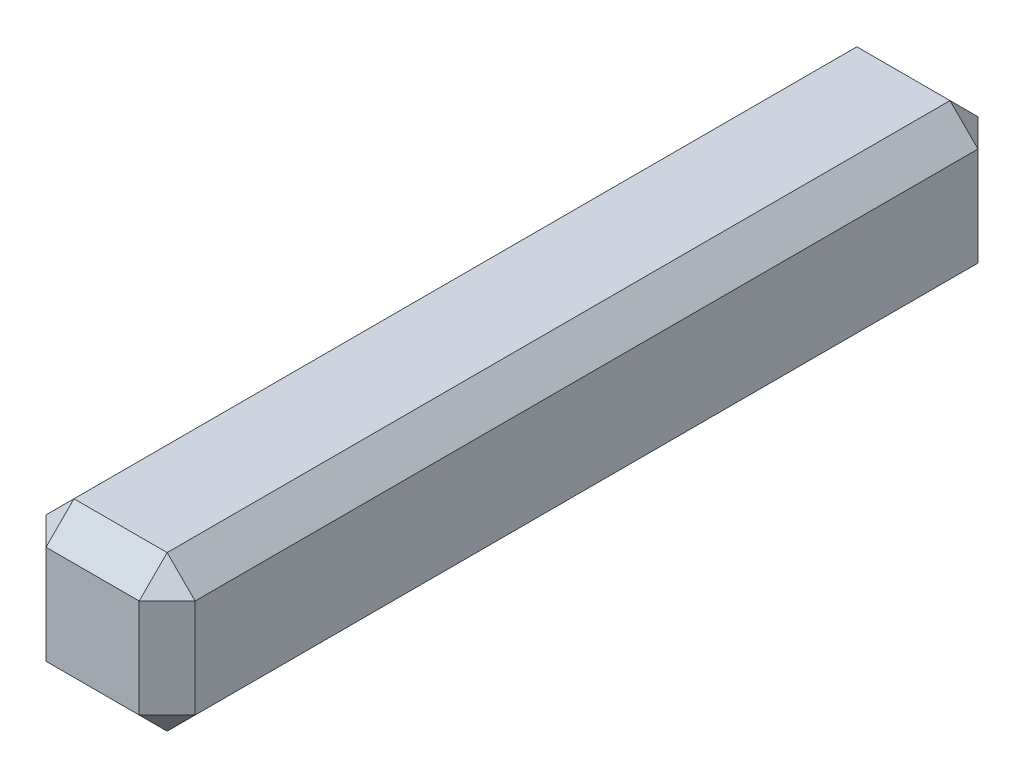
ISO-10303-21;
HEADER;
FILE_DESCRIPTION(('STEP AP214'),'2;1');
FILE_NAME('part.step','',(''),(''),'','','');
FILE_SCHEMA(('AUTOMOTIVE_DESIGN { 1 0 10303 214 1 1 1 1 }'));
ENDSEC;
DATA;
#1=APPLICATION_CONTEXT('core data for automotive mechanical design processes');
#2=APPLICATION_PROTOCOL_DEFINITION('international standard','automotive_design',2000,#1);
#3=PRODUCT_CONTEXT('',#1,'mechanical');
#4=PRODUCT('Part','Part','',(#3));
#5=PRODUCT_RELATED_PRODUCT_CATEGORY('part','',(#4));
#6=PRODUCT_DEFINITION_FORMATION('','',#4);
#7=PRODUCT_DEFINITION_CONTEXT('part definition',#1,'design');
#8=PRODUCT_DEFINITION('design','',#6,#7);
#9=PRODUCT_DEFINITION_SHAPE('','',#8);
#10=(LENGTH_UNIT() NAMED_UNIT(*) SI_UNIT(.MILLI.,.METRE.));
#11=(NAMED_UNIT(*) PLANE_ANGLE_UNIT() SI_UNIT($,.RADIAN.));
#12=(NAMED_UNIT(*) SI_UNIT($,.STERADIAN.) SOLID_ANGLE_UNIT());
#13=UNCERTAINTY_MEASURE_WITH_UNIT(LENGTH_MEASURE(1.E-05),#10,'distance_accuracy_value','');
#14=(GEOMETRIC_REPRESENTATION_CONTEXT(3) GLOBAL_UNCERTAINTY_ASSIGNED_CONTEXT((#13)) GLOBAL_UNIT_ASSIGNED_CONTEXT((#10,
#11,#12)) REPRESENTATION_CONTEXT('',''));
#15=CARTESIAN_POINT('',(0.,0.,0.));
#16=DIRECTION('',(0.,0.,1.));
#17=DIRECTION('',(1.,0.,0.));
#18=AXIS2_PLACEMENT_3D('',#15,#16,#17);
#19=CARTESIAN_POINT('',(-4.34033741648107,4.503,45.));
#20=DIRECTION('',(1.,0.,0.));
#21=DIRECTION('',(0.,1.,0.));
#22=AXIS2_PLACEMENT_3D('',#19,#20,#21);
#23=PLANE('',#22);
#24=DIRECTION('',(0.,0.,1.));
#25=VECTOR('',#24,1.);
#26=CARTESIAN_POINT('',(-4.34033741648107,-2.297,45.));
#27=LINE('',#26,#25);
#28=CARTESIAN_POINT('',(-4.34033741648107,-2.297,1.5));
#29=VERTEX_POINT('',#28);
#30=CARTESIAN_POINT('',(-4.34033741648107,-2.297,43.5));
#31=VERTEX_POINT('',#30);
#32=EDGE_CURVE('E178',#29,#31,#27,.T.);
#33=ORIENTED_EDGE('',*,*,#32,.T.);
#34=DIRECTION('',(0.,1.,0.));
#35=VECTOR('',#34,1.);
#36=CARTESIAN_POINT('',(-4.34033741648107,4.503,43.5));
#37=LINE('',#36,#35);
#38=CARTESIAN_POINT('',(-4.34033741648107,3.003,43.5));
#39=VERTEX_POINT('',#38);
#40=EDGE_CURVE('E180',#31,#39,#37,.T.);
#41=ORIENTED_EDGE('',*,*,#40,.T.);
#42=DIRECTION('',(0.,0.,-1.));
#43=VECTOR('',#42,1.);
#44=CARTESIAN_POINT('',(-4.34033741648107,3.003,45.));
#45=LINE('',#44,#43);
#46=CARTESIAN_POINT('',(-4.34033741648107,3.003,1.5));
#47=VERTEX_POINT('',#46);
#48=EDGE_CURVE('E174',#39,#47,#45,.T.);
#49=ORIENTED_EDGE('',*,*,#48,.T.);
#50=DIRECTION('',(0.,-1.,0.));
#51=VECTOR('',#50,1.);
#52=CARTESIAN_POINT('',(-4.34033741648107,4.503,1.5));
#53=LINE('',#52,#51);
#54=EDGE_CURVE('E176',#47,#29,#53,.T.);
#55=ORIENTED_EDGE('',*,*,#54,.T.);
#56=EDGE_LOOP('',(#33,#41,#49,#55));
#57=FACE_BOUND('',#56,.T.);
#58=ADVANCED_FACE('F35',(#57),#23,.F.);
#59=CARTESIAN_POINT('',(-4.34033741648107,-3.797,45.));
#60=DIRECTION('',(0.,1.,0.));
#61=DIRECTION('',(0.,0.,1.));
#62=AXIS2_PLACEMENT_3D('',#59,#60,#61);
#63=PLANE('',#62);
#64=DIRECTION('',(0.,0.,1.));
#65=VECTOR('',#64,1.);
#66=CARTESIAN_POINT('',(2.15966258351893,-3.797,45.));
#67=LINE('',#66,#65);
#68=CARTESIAN_POINT('',(2.15966258351893,-3.797,1.5));
#69=VERTEX_POINT('',#68);
#70=CARTESIAN_POINT('',(2.15966258351893,-3.797,43.5));
#71=VERTEX_POINT('',#70);
#72=EDGE_CURVE('E187',#69,#71,#67,.T.);
#73=ORIENTED_EDGE('',*,*,#72,.T.);
#74=DIRECTION('',(-1.,0.,0.));
#75=VECTOR('',#74,1.);
#76=CARTESIAN_POINT('',(-4.34033741648107,-3.797,43.5));
#77=LINE('',#76,#75);
#78=CARTESIAN_POINT('',(-2.84033741648107,-3.797,43.5));
#79=VERTEX_POINT('',#78);
#80=EDGE_CURVE('E189',#71,#79,#77,.T.);
#81=ORIENTED_EDGE('',*,*,#80,.T.);
#82=DIRECTION('',(0.,0.,-1.));
#83=VECTOR('',#82,1.);
#84=CARTESIAN_POINT('',(-2.84033741648107,-3.797,45.));
#85=LINE('',#84,#83);
#86=CARTESIAN_POINT('',(-2.84033741648107,-3.797,1.5));
#87=VERTEX_POINT('',#86);
#88=EDGE_CURVE('E183',#79,#87,#85,.T.);
#89=ORIENTED_EDGE('',*,*,#88,.T.);
#90=DIRECTION('',(1.,0.,0.));
#91=VECTOR('',#90,1.);
#92=CARTESIAN_POINT('',(-4.34033741648107,-3.797,1.5));
#93=LINE('',#92,#91);
#94=EDGE_CURVE('E185',#87,#69,#93,.T.);
#95=ORIENTED_EDGE('',*,*,#94,.T.);
#96=EDGE_LOOP('',(#73,#81,#89,#95));
#97=FACE_BOUND('',#96,.T.);
#98=ADVANCED_FACE('F272',(#97),#63,.F.);
#99=CARTESIAN_POINT('',(3.65966258351893,4.503,45.));
#100=DIRECTION('',(-1.,0.,0.));
#101=DIRECTION('',(0.,-1.,0.));
#102=AXIS2_PLACEMENT_3D('',#99,#100,#101);
#103=PLANE('',#102);
#104=DIRECTION('',(0.,-1.,0.));
#105=VECTOR('',#104,1.);
#106=CARTESIAN_POINT('',(3.65966258351893,-3.797,43.5));
#107=LINE('',#106,#105);
#108=CARTESIAN_POINT('',(3.65966258351893,3.003,43.5));
#109=VERTEX_POINT('',#108);
#110=CARTESIAN_POINT('',(3.65966258351893,-2.297,43.5));
#111=VERTEX_POINT('',#110);
#112=EDGE_CURVE('E135',#109,#111,#107,.T.);
#113=ORIENTED_EDGE('',*,*,#112,.T.);
#114=DIRECTION('',(0.,0.,-1.));
#115=VECTOR('',#114,1.);
#116=CARTESIAN_POINT('',(3.65966258351893,-2.297,45.));
#117=LINE('',#116,#115);
#118=CARTESIAN_POINT('',(3.65966258351893,-2.297,1.5));
#119=VERTEX_POINT('',#118);
#120=EDGE_CURVE('E172',#111,#119,#117,.T.);
#121=ORIENTED_EDGE('',*,*,#120,.T.);
#122=DIRECTION('',(0.,1.,0.));
#123=VECTOR('',#122,1.);
#124=CARTESIAN_POINT('',(3.65966258351893,4.503,1.5));
#125=LINE('',#124,#123);
#126=CARTESIAN_POINT('',(3.65966258351893,3.003,1.5));
#127=VERTEX_POINT('',#126);
#128=EDGE_CURVE('E169',#119,#127,#125,.T.);
#129=ORIENTED_EDGE('',*,*,#128,.T.);
#130=DIRECTION('',(0.,0.,1.));
#131=VECTOR('',#130,1.);
#132=CARTESIAN_POINT('',(3.65966258351893,3.003,45.));
#133=LINE('',#132,#131);
#134=EDGE_CURVE('E164',#127,#109,#133,.T.);
#135=ORIENTED_EDGE('',*,*,#134,.T.);
#136=EDGE_LOOP('',(#113,#121,#129,#135));
#137=FACE_BOUND('',#136,.T.);
#138=ADVANCED_FACE('F333',(#137),#103,.F.);
#139=CARTESIAN_POINT('',(-4.34033741648107,4.503,45.));
#140=DIRECTION('',(0.,-1.,0.));
#141=DIRECTION('',(0.,0.,-1.));
#142=AXIS2_PLACEMENT_3D('',#139,#140,#141);
#143=PLANE('',#142);
#144=DIRECTION('',(0.,0.,1.));
#145=VECTOR('',#144,1.);
#146=CARTESIAN_POINT('',(-2.84033741648107,4.503,45.));
#147=LINE('',#146,#145);
#148=CARTESIAN_POINT('',(-2.84033741648107,4.503,1.5));
#149=VERTEX_POINT('',#148);
#150=CARTESIAN_POINT('',(-2.84033741648107,4.503,43.5));
#151=VERTEX_POINT('',#150);
#152=EDGE_CURVE('E196',#149,#151,#147,.T.);
#153=ORIENTED_EDGE('',*,*,#152,.T.);
#154=DIRECTION('',(1.,0.,0.));
#155=VECTOR('',#154,1.);
#156=CARTESIAN_POINT('',(3.65966258351893,4.503,43.5));
#157=LINE('',#156,#155);
#158=CARTESIAN_POINT('',(2.15966258351893,4.503,43.5));
#159=VERTEX_POINT('',#158);
#160=EDGE_CURVE('E198',#151,#159,#157,.T.);
#161=ORIENTED_EDGE('',*,*,#160,.T.);
#162=DIRECTION('',(0.,0.,-1.));
#163=VECTOR('',#162,1.);
#164=CARTESIAN_POINT('',(2.15966258351893,4.503,45.));
#165=LINE('',#164,#163);
#166=CARTESIAN_POINT('',(2.15966258351893,4.503,1.5));
#167=VERTEX_POINT('',#166);
#168=EDGE_CURVE('E192',#159,#167,#165,.T.);
#169=ORIENTED_EDGE('',*,*,#168,.T.);
#170=DIRECTION('',(-1.,0.,0.));
#171=VECTOR('',#170,1.);
#172=CARTESIAN_POINT('',(-4.34033741648107,4.503,1.5));
#173=LINE('',#172,#171);
#174=EDGE_CURVE('E194',#167,#149,#173,.T.);
#175=ORIENTED_EDGE('',*,*,#174,.T.);
#176=EDGE_LOOP('',(#153,#161,#169,#175));
#177=FACE_BOUND('',#176,.T.);
#178=ADVANCED_FACE('F432',(#177),#143,.F.);
#179=CARTESIAN_POINT('',(0.,0.,45.));
#180=DIRECTION('',(0.,0.,1.));
#181=DIRECTION('',(1.,0.,0.));
#182=AXIS2_PLACEMENT_3D('',#179,#180,#181);
#183=PLANE('',#182);
#184=DIRECTION('',(0.,-1.,0.));
#185=VECTOR('',#184,1.);
#186=CARTESIAN_POINT('',(-2.84033741648107,-3.797,45.));
#187=LINE('',#186,#185);
#188=CARTESIAN_POINT('',(-2.84033741648107,3.003,45.));
#189=VERTEX_POINT('',#188);
#190=CARTESIAN_POINT('',(-2.84033741648107,-2.297,45.));
#191=VERTEX_POINT('',#190);
#192=EDGE_CURVE('E157',#189,#191,#187,.T.);
#193=ORIENTED_EDGE('',*,*,#192,.T.);
#194=DIRECTION('',(1.,0.,0.));
#195=VECTOR('',#194,1.);
#196=CARTESIAN_POINT('',(3.65966258351893,-2.297,45.));
#197=LINE('',#196,#195);
#198=CARTESIAN_POINT('',(2.15966258351893,-2.297,45.));
#199=VERTEX_POINT('',#198);
#200=EDGE_CURVE('E161',#191,#199,#197,.T.);
#201=ORIENTED_EDGE('',*,*,#200,.T.);
#202=DIRECTION('',(0.,1.,0.));
#203=VECTOR('',#202,1.);
#204=CARTESIAN_POINT('',(2.15966258351893,4.503,45.));
#205=LINE('',#204,#203);
#206=CARTESIAN_POINT('',(2.15966258351893,3.003,45.));
#207=VERTEX_POINT('',#206);
#208=EDGE_CURVE('E133',#199,#207,#205,.T.);
#209=ORIENTED_EDGE('',*,*,#208,.T.);
#210=DIRECTION('',(-1.,0.,0.));
#211=VECTOR('',#210,1.);
#212=CARTESIAN_POINT('',(-4.34033741648107,3.003,45.));
#213=LINE('',#212,#211);
#214=EDGE_CURVE('E151',#207,#189,#213,.T.);
#215=ORIENTED_EDGE('',*,*,#214,.T.);
#216=EDGE_LOOP('',(#193,#201,#209,#215));
#217=FACE_BOUND('',#216,.T.);
#218=ADVANCED_FACE('F159',(#217),#183,.T.);
#219=CARTESIAN_POINT('',(0.,0.,0.));
#220=DIRECTION('',(0.,0.,1.));
#221=DIRECTION('',(1.,0.,0.));
#222=AXIS2_PLACEMENT_3D('',#219,#220,#221);
#223=PLANE('',#222);
#224=DIRECTION('',(1.,0.,0.));
#225=VECTOR('',#224,1.);
#226=CARTESIAN_POINT('',(0.,3.003,0.));
#227=LINE('',#226,#225);
#228=CARTESIAN_POINT('',(-2.84033741648107,3.003,0.));
#229=VERTEX_POINT('',#228);
#230=CARTESIAN_POINT('',(2.15966258351893,3.003,0.));
#231=VERTEX_POINT('',#230);
#232=EDGE_CURVE('E201',#229,#231,#227,.T.);
#233=ORIENTED_EDGE('',*,*,#232,.T.);
#234=DIRECTION('',(0.,-1.,0.));
#235=VECTOR('',#234,1.);
#236=CARTESIAN_POINT('',(2.15966258351893,0.,0.));
#237=LINE('',#236,#235);
#238=CARTESIAN_POINT('',(2.15966258351893,-2.297,0.));
#239=VERTEX_POINT('',#238);
#240=EDGE_CURVE('E11',#231,#239,#237,.T.);
#241=ORIENTED_EDGE('',*,*,#240,.T.);
#242=DIRECTION('',(-1.,0.,0.));
#243=VECTOR('',#242,1.);
#244=CARTESIAN_POINT('',(0.,-2.297,0.));
#245=LINE('',#244,#243);
#246=CARTESIAN_POINT('',(-2.84033741648107,-2.297,0.));
#247=VERTEX_POINT('',#246);
#248=EDGE_CURVE('E45',#239,#247,#245,.T.);
#249=ORIENTED_EDGE('',*,*,#248,.T.);
#250=DIRECTION('',(0.,1.,0.));
#251=VECTOR('',#250,1.);
#252=CARTESIAN_POINT('',(-2.84033741648107,0.,0.));
#253=LINE('',#252,#251);
#254=EDGE_CURVE('E203',#247,#229,#253,.T.);
#255=ORIENTED_EDGE('',*,*,#254,.T.);
#256=EDGE_LOOP('',(#233,#241,#249,#255));
#257=FACE_BOUND('',#256,.T.);
#258=ADVANCED_FACE('F299',(#257),#223,.F.);
#259=CARTESIAN_POINT('',(-4.34033741648107,4.503,1.5));
#260=DIRECTION('',(0.707106781186548,0.,0.707106781186547));
#261=DIRECTION('',(0.,-1.,0.));
#262=AXIS2_PLACEMENT_3D('',#259,#260,#261);
#263=PLANE('',#262);
#264=DIRECTION('',(-0.707106781186547,0.,0.707106781186548));
#265=VECTOR('',#264,1.);
#266=CARTESIAN_POINT('',(-2.84033741648107,-2.297,0.));
#267=LINE('',#266,#265);
#268=EDGE_CURVE('E40',#29,#247,#267,.F.);
#269=ORIENTED_EDGE('',*,*,#268,.F.);
#270=ORIENTED_EDGE('',*,*,#54,.F.);
#271=DIRECTION('',(0.707106781186547,0.,-0.707106781186548));
#272=VECTOR('',#271,1.);
#273=CARTESIAN_POINT('',(-2.84033741648107,3.003,0.));
#274=LINE('',#273,#272);
#275=EDGE_CURVE('E253',#229,#47,#274,.F.);
#276=ORIENTED_EDGE('',*,*,#275,.F.);
#277=ORIENTED_EDGE('',*,*,#254,.F.);
#278=EDGE_LOOP('',(#269,#270,#276,#277));
#279=FACE_BOUND('',#278,.T.);
#280=ADVANCED_FACE('F38',(#279),#263,.F.);
#281=CARTESIAN_POINT('',(-2.84033741648107,-2.297,0.));
#282=DIRECTION('',(-0.577350269189626,-0.577350269189626,-0.577350269189626));
#283=DIRECTION('',(0.707106781186548,-0.707106781186548,0.));
#284=AXIS2_PLACEMENT_3D('',#281,#282,#283);
#285=PLANE('',#284);
#286=DIRECTION('',(0.707106781186547,-0.707106781186547,0.));
#287=VECTOR('',#286,1.);
#288=CARTESIAN_POINT('',(-3.59033741648107,-3.047,1.5));
#289=LINE('',#288,#287);
#290=EDGE_CURVE('E248',#29,#87,#289,.T.);
#291=ORIENTED_EDGE('',*,*,#290,.F.);
#292=ORIENTED_EDGE('',*,*,#268,.T.);
#293=DIRECTION('',(0.,0.707106781186547,-0.707106781186547));
#294=VECTOR('',#293,1.);
#295=CARTESIAN_POINT('',(-2.84033741648107,-2.297,0.));
#296=LINE('',#295,#294);
#297=EDGE_CURVE('E251',#87,#247,#296,.T.);
#298=ORIENTED_EDGE('',*,*,#297,.F.);
#299=EDGE_LOOP('',(#291,#292,#298));
#300=FACE_BOUND('',#299,.T.);
#301=ADVANCED_FACE('F264',(#300),#285,.T.);
#302=CARTESIAN_POINT('',(-2.84033741648107,3.003,0.));
#303=DIRECTION('',(-0.577350269189626,0.577350269189626,-0.577350269189626));
#304=DIRECTION('',(0.,0.707106781186547,0.707106781186548));
#305=AXIS2_PLACEMENT_3D('',#302,#303,#304);
#306=PLANE('',#305);
#307=DIRECTION('',(0.,0.707106781186547,0.707106781186548));
#308=VECTOR('',#307,1.);
#309=CARTESIAN_POINT('',(-2.84033741648107,3.003,0.));
#310=LINE('',#309,#308);
#311=EDGE_CURVE('E242',#229,#149,#310,.T.);
#312=ORIENTED_EDGE('',*,*,#311,.F.);
#313=ORIENTED_EDGE('',*,*,#275,.T.);
#314=DIRECTION('',(-0.707106781186547,-0.707106781186547,0.));
#315=VECTOR('',#314,1.);
#316=CARTESIAN_POINT('',(-3.59033741648107,3.753,1.5));
#317=LINE('',#316,#315);
#318=EDGE_CURVE('E245',#149,#47,#317,.T.);
#319=ORIENTED_EDGE('',*,*,#318,.F.);
#320=EDGE_LOOP('',(#312,#313,#319));
#321=FACE_BOUND('',#320,.T.);
#322=ADVANCED_FACE('F293',(#321),#306,.T.);
#323=CARTESIAN_POINT('',(-4.34033741648107,-3.797,1.5));
#324=DIRECTION('',(0.,0.707106781186548,0.707106781186547));
#325=DIRECTION('',(1.,0.,0.));
#326=AXIS2_PLACEMENT_3D('',#323,#324,#325);
#327=PLANE('',#326);
#328=ORIENTED_EDGE('',*,*,#297,.T.);
#329=ORIENTED_EDGE('',*,*,#248,.F.);
#330=DIRECTION('',(0.,-0.707106781186547,0.707106781186548));
#331=VECTOR('',#330,1.);
#332=CARTESIAN_POINT('',(2.15966258351893,-2.297,0.));
#333=LINE('',#332,#331);
#334=EDGE_CURVE('E53',#69,#239,#333,.F.);
#335=ORIENTED_EDGE('',*,*,#334,.F.);
#336=ORIENTED_EDGE('',*,*,#94,.F.);
#337=EDGE_LOOP('',(#328,#329,#335,#336));
#338=FACE_BOUND('',#337,.T.);
#339=ADVANCED_FACE('F270',(#338),#327,.F.);
#340=CARTESIAN_POINT('',(-2.84033741648107,-3.797,45.));
#341=DIRECTION('',(0.707106781186547,0.707106781186547,0.));
#342=DIRECTION('',(0.,0.,-1.));
#343=AXIS2_PLACEMENT_3D('',#340,#341,#342);
#344=PLANE('',#343);
#345=ORIENTED_EDGE('',*,*,#290,.T.);
#346=ORIENTED_EDGE('',*,*,#88,.F.);
#347=DIRECTION('',(-0.707106781186547,0.707106781186547,0.));
#348=VECTOR('',#347,1.);
#349=CARTESIAN_POINT('',(-3.59033741648107,-3.047,43.5));
#350=LINE('',#349,#348);
#351=EDGE_CURVE('E236',#31,#79,#350,.F.);
#352=ORIENTED_EDGE('',*,*,#351,.F.);
#353=ORIENTED_EDGE('',*,*,#32,.F.);
#354=EDGE_LOOP('',(#345,#346,#352,#353));
#355=FACE_BOUND('',#354,.T.);
#356=ADVANCED_FACE('F278',(#355),#344,.F.);
#357=CARTESIAN_POINT('',(-2.84033741648107,0.,45.));
#358=DIRECTION('',(-0.707106781186548,0.,0.707106781186547));
#359=DIRECTION('',(0.,1.,0.));
#360=AXIS2_PLACEMENT_3D('',#357,#358,#359);
#361=PLANE('',#360);
#362=DIRECTION('',(0.707106781186547,0.,0.707106781186548));
#363=VECTOR('',#362,1.);
#364=CARTESIAN_POINT('',(-4.34033741648107,3.003,43.5));
#365=LINE('',#364,#363);
#366=EDGE_CURVE('E230',#39,#189,#365,.T.);
#367=ORIENTED_EDGE('',*,*,#366,.F.);
#368=ORIENTED_EDGE('',*,*,#40,.F.);
#369=DIRECTION('',(-0.707106781186547,0.,-0.707106781186548));
#370=VECTOR('',#369,1.);
#371=CARTESIAN_POINT('',(-2.84033741648107,-2.297,45.));
#372=LINE('',#371,#370);
#373=EDGE_CURVE('E233',#191,#31,#372,.T.);
#374=ORIENTED_EDGE('',*,*,#373,.F.);
#375=ORIENTED_EDGE('',*,*,#192,.F.);
#376=EDGE_LOOP('',(#367,#368,#374,#375));
#377=FACE_BOUND('',#376,.T.);
#378=ADVANCED_FACE('F284',(#377),#361,.T.);
#379=CARTESIAN_POINT('',(-4.34033741648107,3.003,45.));
#380=DIRECTION('',(0.707106781186547,-0.707106781186547,0.));
#381=DIRECTION('',(0.,0.,-1.));
#382=AXIS2_PLACEMENT_3D('',#379,#380,#381);
#383=PLANE('',#382);
#384=ORIENTED_EDGE('',*,*,#318,.T.);
#385=ORIENTED_EDGE('',*,*,#48,.F.);
#386=DIRECTION('',(0.707106781186547,0.707106781186547,0.));
#387=VECTOR('',#386,1.);
#388=CARTESIAN_POINT('',(-4.34033741648107,3.003,43.5));
#389=LINE('',#388,#387);
#390=EDGE_CURVE('E228',#151,#39,#389,.F.);
#391=ORIENTED_EDGE('',*,*,#390,.F.);
#392=ORIENTED_EDGE('',*,*,#152,.F.);
#393=EDGE_LOOP('',(#384,#385,#391,#392));
#394=FACE_BOUND('',#393,.T.);
#395=ADVANCED_FACE('F290',(#394),#383,.F.);
#396=CARTESIAN_POINT('',(-4.34033741648107,4.503,1.5));
#397=DIRECTION('',(0.,-0.707106781186548,0.707106781186547));
#398=DIRECTION('',(-1.,0.,0.));
#399=AXIS2_PLACEMENT_3D('',#396,#397,#398);
#400=PLANE('',#399);
#401=ORIENTED_EDGE('',*,*,#311,.T.);
#402=ORIENTED_EDGE('',*,*,#174,.F.);
#403=DIRECTION('',(0.,-0.707106781186547,-0.707106781186548));
#404=VECTOR('',#403,1.);
#405=CARTESIAN_POINT('',(2.15966258351893,3.753,0.750000000000001));
#406=LINE('',#405,#404);
#407=EDGE_CURVE('E225',#231,#167,#406,.F.);
#408=ORIENTED_EDGE('',*,*,#407,.F.);
#409=ORIENTED_EDGE('',*,*,#232,.F.);
#410=EDGE_LOOP('',(#401,#402,#408,#409));
#411=FACE_BOUND('',#410,.T.);
#412=ADVANCED_FACE('F297',(#411),#400,.F.);
#413=CARTESIAN_POINT('',(3.65966258351893,4.503,1.5));
#414=DIRECTION('',(-0.707106781186548,0.,0.707106781186547));
#415=DIRECTION('',(0.,1.,0.));
#416=AXIS2_PLACEMENT_3D('',#413,#414,#415);
#417=PLANE('',#416);
#418=DIRECTION('',(-0.707106781186547,0.,-0.707106781186548));
#419=VECTOR('',#418,1.);
#420=CARTESIAN_POINT('',(2.15966258351893,-2.297,0.));
#421=LINE('',#420,#419);
#422=EDGE_CURVE('E240',#239,#119,#421,.F.);
#423=ORIENTED_EDGE('',*,*,#422,.F.);
#424=ORIENTED_EDGE('',*,*,#240,.F.);
#425=DIRECTION('',(0.707106781186547,0.,0.707106781186547));
#426=VECTOR('',#425,1.);
#427=CARTESIAN_POINT('',(3.65966258351893,3.003,1.5));
#428=LINE('',#427,#426);
#429=EDGE_CURVE('E222',#127,#231,#428,.F.);
#430=ORIENTED_EDGE('',*,*,#429,.F.);
#431=ORIENTED_EDGE('',*,*,#128,.F.);
#432=EDGE_LOOP('',(#423,#424,#430,#431));
#433=FACE_BOUND('',#432,.T.);
#434=ADVANCED_FACE('F302',(#433),#417,.F.);
#435=CARTESIAN_POINT('',(2.15966258351893,-2.297,0.));
#436=DIRECTION('',(0.577350269189626,-0.577350269189626,-0.577350269189626));
#437=DIRECTION('',(0.707106781186547,0.707106781186548,0.));
#438=AXIS2_PLACEMENT_3D('',#435,#436,#437);
#439=PLANE('',#438);
#440=ORIENTED_EDGE('',*,*,#334,.T.);
#441=ORIENTED_EDGE('',*,*,#422,.T.);
#442=DIRECTION('',(0.707106781186547,0.707106781186548,0.));
#443=VECTOR('',#442,1.);
#444=CARTESIAN_POINT('',(2.90966258351893,-3.047,1.5));
#445=LINE('',#444,#443);
#446=EDGE_CURVE('E219',#69,#119,#445,.T.);
#447=ORIENTED_EDGE('',*,*,#446,.F.);
#448=EDGE_LOOP('',(#440,#441,#447));
#449=FACE_BOUND('',#448,.T.);
#450=ADVANCED_FACE('F305',(#449),#439,.T.);
#451=CARTESIAN_POINT('',(-2.84033741648107,-2.297,45.));
#452=DIRECTION('',(-0.577350269189626,-0.577350269189626,0.577350269189626));
#453=DIRECTION('',(0.707106781186548,-0.707106781186548,0.));
#454=AXIS2_PLACEMENT_3D('',#451,#452,#453);
#455=PLANE('',#454);
#456=ORIENTED_EDGE('',*,*,#373,.T.);
#457=ORIENTED_EDGE('',*,*,#351,.T.);
#458=DIRECTION('',(0.,0.707106781186547,0.707106781186547));
#459=VECTOR('',#458,1.);
#460=CARTESIAN_POINT('',(-2.84033741648107,-2.297,45.));
#461=LINE('',#460,#459);
#462=EDGE_CURVE('E217',#191,#79,#461,.F.);
#463=ORIENTED_EDGE('',*,*,#462,.F.);
#464=EDGE_LOOP('',(#456,#457,#463));
#465=FACE_BOUND('',#464,.T.);
#466=ADVANCED_FACE('F316',(#465),#455,.T.);
#467=CARTESIAN_POINT('',(-4.34033741648107,3.003,43.5));
#468=DIRECTION('',(-0.577350269189626,0.577350269189626,0.577350269189626));
#469=DIRECTION('',(0.,-0.707106781186547,0.707106781186548));
#470=AXIS2_PLACEMENT_3D('',#467,#468,#469);
#471=PLANE('',#470);
#472=ORIENTED_EDGE('',*,*,#390,.T.);
#473=ORIENTED_EDGE('',*,*,#366,.T.);
#474=DIRECTION('',(0.,0.707106781186547,-0.707106781186548));
#475=VECTOR('',#474,1.);
#476=CARTESIAN_POINT('',(-2.84033741648107,3.753,44.25));
#477=LINE('',#476,#475);
#478=EDGE_CURVE('E154',#151,#189,#477,.F.);
#479=ORIENTED_EDGE('',*,*,#478,.F.);
#480=EDGE_LOOP('',(#472,#473,#479));
#481=FACE_BOUND('',#480,.T.);
#482=ADVANCED_FACE('F318',(#481),#471,.T.);
#483=CARTESIAN_POINT('',(3.65966258351893,3.003,1.5));
#484=DIRECTION('',(0.577350269189626,0.577350269189626,-0.577350269189626));
#485=DIRECTION('',(-0.707106781186548,0.707106781186547,0.));
#486=AXIS2_PLACEMENT_3D('',#483,#484,#485);
#487=PLANE('',#486);
#488=ORIENTED_EDGE('',*,*,#429,.T.);
#489=ORIENTED_EDGE('',*,*,#407,.T.);
#490=DIRECTION('',(-0.707106781186548,0.707106781186547,0.));
#491=VECTOR('',#490,1.);
#492=CARTESIAN_POINT('',(3.65966258351893,3.003,1.5));
#493=LINE('',#492,#491);
#494=EDGE_CURVE('E213',#127,#167,#493,.T.);
#495=ORIENTED_EDGE('',*,*,#494,.F.);
#496=EDGE_LOOP('',(#488,#489,#495));
#497=FACE_BOUND('',#496,.T.);
#498=ADVANCED_FACE('F324',(#497),#487,.T.);
#499=CARTESIAN_POINT('',(3.65966258351893,-2.297,45.));
#500=DIRECTION('',(-0.707106781186548,0.707106781186547,0.));
#501=DIRECTION('',(0.,0.,-1.));
#502=AXIS2_PLACEMENT_3D('',#499,#500,#501);
#503=PLANE('',#502);
#504=ORIENTED_EDGE('',*,*,#446,.T.);
#505=ORIENTED_EDGE('',*,*,#120,.F.);
#506=DIRECTION('',(-0.707106781186547,-0.707106781186548,0.));
#507=VECTOR('',#506,1.);
#508=CARTESIAN_POINT('',(3.65966258351893,-2.297,43.5));
#509=LINE('',#508,#507);
#510=EDGE_CURVE('E210',#71,#111,#509,.F.);
#511=ORIENTED_EDGE('',*,*,#510,.F.);
#512=ORIENTED_EDGE('',*,*,#72,.F.);
#513=EDGE_LOOP('',(#504,#505,#511,#512));
#514=FACE_BOUND('',#513,.T.);
#515=ADVANCED_FACE('F308',(#514),#503,.F.);
#516=CARTESIAN_POINT('',(0.,-2.297,45.));
#517=DIRECTION('',(0.,-0.707106781186548,0.707106781186547));
#518=DIRECTION('',(-1.,0.,0.));
#519=AXIS2_PLACEMENT_3D('',#516,#517,#518);
#520=PLANE('',#519);
#521=ORIENTED_EDGE('',*,*,#462,.T.);
#522=ORIENTED_EDGE('',*,*,#80,.F.);
#523=DIRECTION('',(0.,-0.707106781186547,-0.707106781186548));
#524=VECTOR('',#523,1.);
#525=CARTESIAN_POINT('',(2.15966258351893,-3.047,44.25));
#526=LINE('',#525,#524);
#527=EDGE_CURVE('E148',#199,#71,#526,.T.);
#528=ORIENTED_EDGE('',*,*,#527,.F.);
#529=ORIENTED_EDGE('',*,*,#200,.F.);
#530=EDGE_LOOP('',(#521,#522,#528,#529));
#531=FACE_BOUND('',#530,.T.);
#532=ADVANCED_FACE('F314',(#531),#520,.T.);
#533=CARTESIAN_POINT('',(0.,3.003,45.));
#534=DIRECTION('',(0.,0.707106781186548,0.707106781186547));
#535=DIRECTION('',(1.,0.,0.));
#536=AXIS2_PLACEMENT_3D('',#533,#534,#535);
#537=PLANE('',#536);
#538=ORIENTED_EDGE('',*,*,#478,.T.);
#539=ORIENTED_EDGE('',*,*,#214,.F.);
#540=DIRECTION('',(0.,-0.707106781186547,0.707106781186548));
#541=VECTOR('',#540,1.);
#542=CARTESIAN_POINT('',(2.15966258351893,3.003,45.));
#543=LINE('',#542,#541);
#544=EDGE_CURVE('E140',#159,#207,#543,.T.);
#545=ORIENTED_EDGE('',*,*,#544,.F.);
#546=ORIENTED_EDGE('',*,*,#160,.F.);
#547=EDGE_LOOP('',(#538,#539,#545,#546));
#548=FACE_BOUND('',#547,.T.);
#549=ADVANCED_FACE('F152',(#548),#537,.T.);
#550=CARTESIAN_POINT('',(2.15966258351893,4.503,45.));
#551=DIRECTION('',(-0.707106781186547,-0.707106781186548,0.));
#552=DIRECTION('',(0.,0.,-1.));
#553=AXIS2_PLACEMENT_3D('',#550,#551,#552);
#554=PLANE('',#553);
#555=ORIENTED_EDGE('',*,*,#494,.T.);
#556=ORIENTED_EDGE('',*,*,#168,.F.);
#557=DIRECTION('',(0.707106781186548,-0.707106781186547,0.));
#558=VECTOR('',#557,1.);
#559=CARTESIAN_POINT('',(2.90966258351893,3.753,43.5));
#560=LINE('',#559,#558);
#561=EDGE_CURVE('E144',#109,#159,#560,.F.);
#562=ORIENTED_EDGE('',*,*,#561,.F.);
#563=ORIENTED_EDGE('',*,*,#134,.F.);
#564=EDGE_LOOP('',(#555,#556,#562,#563));
#565=FACE_BOUND('',#564,.T.);
#566=ADVANCED_FACE('F353',(#565),#554,.F.);
#567=CARTESIAN_POINT('',(3.65966258351893,-2.297,43.5));
#568=DIRECTION('',(0.577350269189626,-0.577350269189626,0.577350269189626));
#569=DIRECTION('',(0.707106781186547,0.707106781186548,0.));
#570=AXIS2_PLACEMENT_3D('',#567,#568,#569);
#571=PLANE('',#570);
#572=ORIENTED_EDGE('',*,*,#527,.T.);
#573=ORIENTED_EDGE('',*,*,#510,.T.);
#574=DIRECTION('',(-0.707106781186547,0.,0.707106781186548));
#575=VECTOR('',#574,1.);
#576=CARTESIAN_POINT('',(3.65966258351893,-2.297,43.5));
#577=LINE('',#576,#575);
#578=EDGE_CURVE('E137',#199,#111,#577,.F.);
#579=ORIENTED_EDGE('',*,*,#578,.F.);
#580=EDGE_LOOP('',(#572,#573,#579));
#581=FACE_BOUND('',#580,.T.);
#582=ADVANCED_FACE('F312',(#581),#571,.T.);
#583=CARTESIAN_POINT('',(2.15966258351893,3.003,45.));
#584=DIRECTION('',(0.577350269189626,0.577350269189626,0.577350269189626));
#585=DIRECTION('',(0.,-0.707106781186547,0.707106781186548));
#586=AXIS2_PLACEMENT_3D('',#583,#584,#585);
#587=PLANE('',#586);
#588=ORIENTED_EDGE('',*,*,#561,.T.);
#589=ORIENTED_EDGE('',*,*,#544,.T.);
#590=DIRECTION('',(0.707106781186547,0.,-0.707106781186547));
#591=VECTOR('',#590,1.);
#592=CARTESIAN_POINT('',(2.15966258351893,3.003,45.));
#593=LINE('',#592,#591);
#594=EDGE_CURVE('E129',#109,#207,#593,.F.);
#595=ORIENTED_EDGE('',*,*,#594,.F.);
#596=EDGE_LOOP('',(#588,#589,#595));
#597=FACE_BOUND('',#596,.T.);
#598=ADVANCED_FACE('F142',(#597),#587,.T.);
#599=CARTESIAN_POINT('',(2.15966258351893,0.,45.));
#600=DIRECTION('',(0.707106781186548,0.,0.707106781186547));
#601=DIRECTION('',(0.,-1.,0.));
#602=AXIS2_PLACEMENT_3D('',#599,#600,#601);
#603=PLANE('',#602);
#604=ORIENTED_EDGE('',*,*,#578,.T.);
#605=ORIENTED_EDGE('',*,*,#112,.F.);
#606=ORIENTED_EDGE('',*,*,#594,.T.);
#607=ORIENTED_EDGE('',*,*,#208,.F.);
#608=EDGE_LOOP('',(#604,#605,#606,#607));
#609=FACE_BOUND('',#608,.T.);
#610=ADVANCED_FACE('F131',(#609),#603,.T.);
#611=CLOSED_SHELL('',(#58,#98,#138,#178,#218,#258,#280,#301,#322,#339,#356,#378,#395,#412,#434,
#450,#466,#482,#498,#515,#532,#549,#566,#582,#598,#610));
#612=MANIFOLD_SOLID_BREP('B2',#611);
#613=ADVANCED_BREP_SHAPE_REPRESENTATION('',(#18,#612),#14);
#614=SHAPE_DEFINITION_REPRESENTATION(#9,#613);
ENDSEC;
END-ISO-10303-21;
